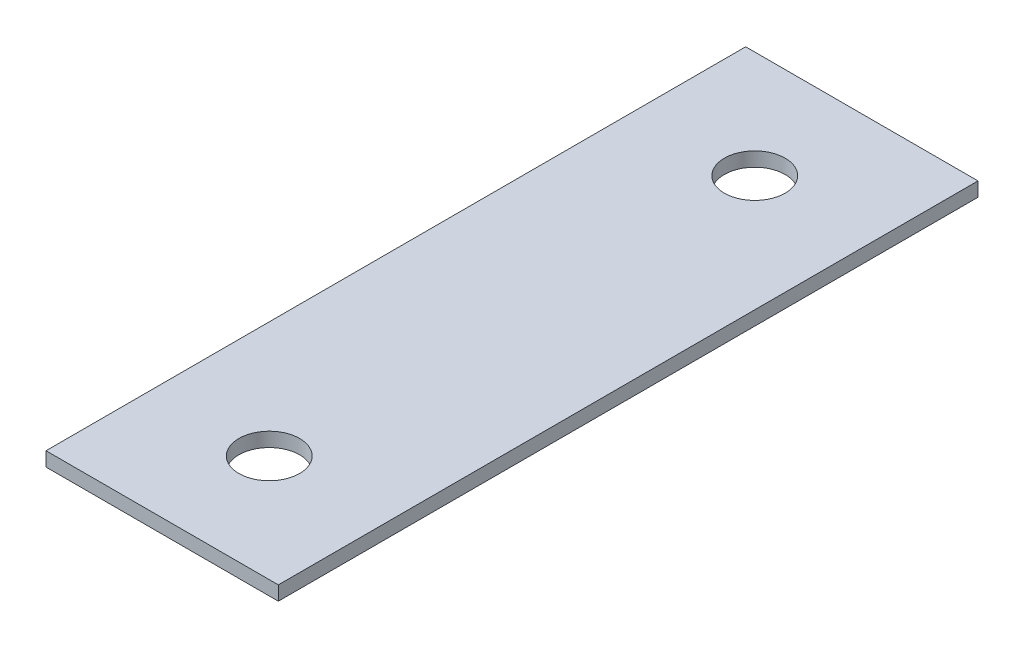
ISO-10303-21;
HEADER;
FILE_DESCRIPTION(('STEP AP214'),'2;1');
FILE_NAME('part.step','',(''),(''),'','','');
FILE_SCHEMA(('AUTOMOTIVE_DESIGN { 1 0 10303 214 1 1 1 1 }'));
ENDSEC;
DATA;
#1=APPLICATION_CONTEXT('core data for automotive mechanical design processes');
#2=APPLICATION_PROTOCOL_DEFINITION('international standard','automotive_design',2000,#1);
#3=PRODUCT_CONTEXT('',#1,'mechanical');
#4=PRODUCT('Part','Part','',(#3));
#5=PRODUCT_RELATED_PRODUCT_CATEGORY('part','',(#4));
#6=PRODUCT_DEFINITION_FORMATION('','',#4);
#7=PRODUCT_DEFINITION_CONTEXT('part definition',#1,'design');
#8=PRODUCT_DEFINITION('design','',#6,#7);
#9=PRODUCT_DEFINITION_SHAPE('','',#8);
#10=(LENGTH_UNIT() NAMED_UNIT(*) SI_UNIT(.MILLI.,.METRE.));
#11=(NAMED_UNIT(*) PLANE_ANGLE_UNIT() SI_UNIT($,.RADIAN.));
#12=(NAMED_UNIT(*) SI_UNIT($,.STERADIAN.) SOLID_ANGLE_UNIT());
#13=UNCERTAINTY_MEASURE_WITH_UNIT(LENGTH_MEASURE(1.E-05),#10,'distance_accuracy_value','');
#14=(GEOMETRIC_REPRESENTATION_CONTEXT(3) GLOBAL_UNCERTAINTY_ASSIGNED_CONTEXT((#13)) GLOBAL_UNIT_ASSIGNED_CONTEXT((#10,
#11,#12)) REPRESENTATION_CONTEXT('',''));
#15=CARTESIAN_POINT('',(0.,0.,0.));
#16=DIRECTION('',(0.,0.,1.));
#17=DIRECTION('',(1.,0.,0.));
#18=AXIS2_PLACEMENT_3D('',#15,#16,#17);
#19=CARTESIAN_POINT('',(0.,0.79375,0.));
#20=DIRECTION('',(1.,0.,0.));
#21=DIRECTION('',(0.,0.,-1.));
#22=AXIS2_PLACEMENT_3D('',#19,#20,#21);
#23=PLANE('',#22);
#24=DIRECTION('',(0.,0.,1.));
#25=VECTOR('',#24,1.);
#26=CARTESIAN_POINT('',(0.,0.,0.));
#27=LINE('',#26,#25);
#28=CARTESIAN_POINT('',(0.,0.,-39.1668));
#29=VERTEX_POINT('',#28);
#30=CARTESIAN_POINT('',(0.,0.,0.));
#31=VERTEX_POINT('',#30);
#32=EDGE_CURVE('E82',#29,#31,#27,.T.);
#33=ORIENTED_EDGE('',*,*,#32,.T.);
#34=DIRECTION('',(0.,-1.,0.));
#35=VECTOR('',#34,1.);
#36=CARTESIAN_POINT('',(0.,0.79375,0.));
#37=LINE('',#36,#35);
#38=CARTESIAN_POINT('',(0.,0.79375,0.));
#39=VERTEX_POINT('',#38);
#40=EDGE_CURVE('E11',#39,#31,#37,.T.);
#41=ORIENTED_EDGE('',*,*,#40,.F.);
#42=DIRECTION('',(0.,0.,1.));
#43=VECTOR('',#42,1.);
#44=CARTESIAN_POINT('',(0.,0.79375,0.));
#45=LINE('',#44,#43);
#46=CARTESIAN_POINT('',(0.,0.79375,-39.1668));
#47=VERTEX_POINT('',#46);
#48=EDGE_CURVE('E69',#47,#39,#45,.T.);
#49=ORIENTED_EDGE('',*,*,#48,.F.);
#50=DIRECTION('',(0.,-1.,0.));
#51=VECTOR('',#50,1.);
#52=CARTESIAN_POINT('',(0.,0.79375,-39.1668));
#53=LINE('',#52,#51);
#54=EDGE_CURVE('E78',#47,#29,#53,.T.);
#55=ORIENTED_EDGE('',*,*,#54,.T.);
#56=EDGE_LOOP('',(#33,#41,#49,#55));
#57=FACE_BOUND('',#56,.T.);
#58=ADVANCED_FACE('F17',(#57),#23,.F.);
#59=CARTESIAN_POINT('',(0.,0.79375,0.));
#60=DIRECTION('',(0.,0.,-1.));
#61=DIRECTION('',(-1.,0.,0.));
#62=AXIS2_PLACEMENT_3D('',#59,#60,#61);
#63=PLANE('',#62);
#64=DIRECTION('',(1.,0.,0.));
#65=VECTOR('',#64,1.);
#66=CARTESIAN_POINT('',(0.,0.,0.));
#67=LINE('',#66,#65);
#68=CARTESIAN_POINT('',(13.0048,0.,0.));
#69=VERTEX_POINT('',#68);
#70=EDGE_CURVE('E73',#31,#69,#67,.T.);
#71=ORIENTED_EDGE('',*,*,#70,.T.);
#72=DIRECTION('',(0.,-1.,0.));
#73=VECTOR('',#72,1.);
#74=CARTESIAN_POINT('',(13.0048,0.79375,0.));
#75=LINE('',#74,#73);
#76=CARTESIAN_POINT('',(13.0048,0.79375,0.));
#77=VERTEX_POINT('',#76);
#78=EDGE_CURVE('E26',#77,#69,#75,.T.);
#79=ORIENTED_EDGE('',*,*,#78,.F.);
#80=DIRECTION('',(1.,0.,0.));
#81=VECTOR('',#80,1.);
#82=CARTESIAN_POINT('',(0.,0.79375,0.));
#83=LINE('',#82,#81);
#84=EDGE_CURVE('E64',#39,#77,#83,.T.);
#85=ORIENTED_EDGE('',*,*,#84,.F.);
#86=ORIENTED_EDGE('',*,*,#40,.T.);
#87=EDGE_LOOP('',(#71,#79,#85,#86));
#88=FACE_BOUND('',#87,.T.);
#89=ADVANCED_FACE('F72',(#88),#63,.F.);
#90=CARTESIAN_POINT('',(13.0048,0.79375,0.));
#91=DIRECTION('',(-1.,0.,0.));
#92=DIRECTION('',(0.,0.,1.));
#93=AXIS2_PLACEMENT_3D('',#90,#91,#92);
#94=PLANE('',#93);
#95=DIRECTION('',(0.,0.,-1.));
#96=VECTOR('',#95,1.);
#97=CARTESIAN_POINT('',(13.0048,0.,0.));
#98=LINE('',#97,#96);
#99=CARTESIAN_POINT('',(13.0048,0.,-39.1668));
#100=VERTEX_POINT('',#99);
#101=EDGE_CURVE('E51',#69,#100,#98,.T.);
#102=ORIENTED_EDGE('',*,*,#101,.T.);
#103=DIRECTION('',(0.,-1.,0.));
#104=VECTOR('',#103,1.);
#105=CARTESIAN_POINT('',(13.0048,0.79375,-39.1668));
#106=LINE('',#105,#104);
#107=CARTESIAN_POINT('',(13.0048,0.79375,-39.1668));
#108=VERTEX_POINT('',#107);
#109=EDGE_CURVE('E74',#108,#100,#106,.T.);
#110=ORIENTED_EDGE('',*,*,#109,.F.);
#111=DIRECTION('',(0.,0.,-1.));
#112=VECTOR('',#111,1.);
#113=CARTESIAN_POINT('',(13.0048,0.79375,0.));
#114=LINE('',#113,#112);
#115=EDGE_CURVE('E67',#77,#108,#114,.T.);
#116=ORIENTED_EDGE('',*,*,#115,.F.);
#117=ORIENTED_EDGE('',*,*,#78,.T.);
#118=EDGE_LOOP('',(#102,#110,#116,#117));
#119=FACE_BOUND('',#118,.T.);
#120=ADVANCED_FACE('F76',(#119),#94,.F.);
#121=CARTESIAN_POINT('',(0.,0.79375,-39.1668));
#122=DIRECTION('',(0.,0.,1.));
#123=DIRECTION('',(1.,0.,0.));
#124=AXIS2_PLACEMENT_3D('',#121,#122,#123);
#125=PLANE('',#124);
#126=DIRECTION('',(-1.,0.,0.));
#127=VECTOR('',#126,1.);
#128=CARTESIAN_POINT('',(0.,0.,-39.1668));
#129=LINE('',#128,#127);
#130=EDGE_CURVE('E57',#100,#29,#129,.T.);
#131=ORIENTED_EDGE('',*,*,#130,.T.);
#132=ORIENTED_EDGE('',*,*,#54,.F.);
#133=DIRECTION('',(-1.,0.,0.));
#134=VECTOR('',#133,1.);
#135=CARTESIAN_POINT('',(0.,0.79375,-39.1668));
#136=LINE('',#135,#134);
#137=EDGE_CURVE('E34',#108,#47,#136,.T.);
#138=ORIENTED_EDGE('',*,*,#137,.F.);
#139=ORIENTED_EDGE('',*,*,#109,.T.);
#140=EDGE_LOOP('',(#131,#132,#138,#139));
#141=FACE_BOUND('',#140,.T.);
#142=ADVANCED_FACE('F90',(#141),#125,.F.);
#143=CARTESIAN_POINT('',(0.,0.79375,0.));
#144=DIRECTION('',(0.,-1.,0.));
#145=DIRECTION('',(0.,0.,-1.));
#146=AXIS2_PLACEMENT_3D('',#143,#144,#145);
#147=PLANE('',#146);
#148=CARTESIAN_POINT('',(6.5024,0.79375,-5.9944));
#149=DIRECTION('',(0.,1.,0.));
#150=DIRECTION('',(0.,0.,1.));
#151=AXIS2_PLACEMENT_3D('',#148,#149,#150);
#152=CIRCLE('',#151,1.7);
#153=CARTESIAN_POINT('',(6.5024,0.79375,-4.2944));
#154=VERTEX_POINT('',#153);
#155=EDGE_CURVE('E101',#154,#154,#152,.T.);
#156=ORIENTED_EDGE('',*,*,#155,.F.);
#157=EDGE_LOOP('',(#156));
#158=FACE_BOUND('',#157,.T.);
#159=CARTESIAN_POINT('',(6.5024,0.79375,-33.1724));
#160=DIRECTION('',(0.,1.,0.));
#161=DIRECTION('',(0.,0.,1.));
#162=AXIS2_PLACEMENT_3D('',#159,#160,#161);
#163=CIRCLE('',#162,1.7);
#164=CARTESIAN_POINT('',(6.5024,0.79375,-31.4724));
#165=VERTEX_POINT('',#164);
#166=EDGE_CURVE('E98',#165,#165,#163,.T.);
#167=ORIENTED_EDGE('',*,*,#166,.F.);
#168=EDGE_LOOP('',(#167));
#169=FACE_BOUND('',#168,.T.);
#170=ORIENTED_EDGE('',*,*,#48,.T.);
#171=ORIENTED_EDGE('',*,*,#84,.T.);
#172=ORIENTED_EDGE('',*,*,#115,.T.);
#173=ORIENTED_EDGE('',*,*,#137,.T.);
#174=EDGE_LOOP('',(#170,#171,#172,#173));
#175=FACE_BOUND('',#174,.T.);
#176=ADVANCED_FACE('F65',(#158,#169,#175),#147,.F.);
#177=CARTESIAN_POINT('',(0.,0.,0.));
#178=DIRECTION('',(0.,-1.,0.));
#179=DIRECTION('',(0.,0.,-1.));
#180=AXIS2_PLACEMENT_3D('',#177,#178,#179);
#181=PLANE('',#180);
#182=CARTESIAN_POINT('',(6.5024,0.,-5.9944));
#183=DIRECTION('',(0.,-1.,0.));
#184=DIRECTION('',(0.,0.,-1.));
#185=AXIS2_PLACEMENT_3D('',#182,#183,#184);
#186=CIRCLE('',#185,1.7);
#187=CARTESIAN_POINT('',(6.5024,0.,-7.6944));
#188=VERTEX_POINT('',#187);
#189=EDGE_CURVE('E20',#188,#188,#186,.T.);
#190=ORIENTED_EDGE('',*,*,#189,.F.);
#191=EDGE_LOOP('',(#190));
#192=FACE_BOUND('',#191,.T.);
#193=CARTESIAN_POINT('',(6.5024,0.,-33.1724));
#194=DIRECTION('',(0.,-1.,0.));
#195=DIRECTION('',(0.,0.,-1.));
#196=AXIS2_PLACEMENT_3D('',#193,#194,#195);
#197=CIRCLE('',#196,1.7);
#198=CARTESIAN_POINT('',(6.5024,0.,-34.8724));
#199=VERTEX_POINT('',#198);
#200=EDGE_CURVE('E85',#199,#199,#197,.T.);
#201=ORIENTED_EDGE('',*,*,#200,.F.);
#202=EDGE_LOOP('',(#201));
#203=FACE_BOUND('',#202,.T.);
#204=ORIENTED_EDGE('',*,*,#32,.F.);
#205=ORIENTED_EDGE('',*,*,#130,.F.);
#206=ORIENTED_EDGE('',*,*,#101,.F.);
#207=ORIENTED_EDGE('',*,*,#70,.F.);
#208=EDGE_LOOP('',(#204,#205,#206,#207));
#209=FACE_BOUND('',#208,.T.);
#210=ADVANCED_FACE('F93',(#192,#203,#209),#181,.T.);
#211=CARTESIAN_POINT('',(6.5024,0.79375,-33.1724));
#212=DIRECTION('',(0.,1.,0.));
#213=DIRECTION('',(0.,0.,1.));
#214=AXIS2_PLACEMENT_3D('',#211,#212,#213);
#215=CYLINDRICAL_SURFACE('',#214,1.7);
#216=ORIENTED_EDGE('',*,*,#200,.T.);
#217=EDGE_LOOP('',(#216));
#218=FACE_BOUND('',#217,.T.);
#219=ORIENTED_EDGE('',*,*,#166,.T.);
#220=EDGE_LOOP('',(#219));
#221=FACE_BOUND('',#220,.T.);
#222=ADVANCED_FACE('F112',(#218,#221),#215,.F.);
#223=CARTESIAN_POINT('',(6.5024,0.79375,-5.9944));
#224=DIRECTION('',(0.,1.,0.));
#225=DIRECTION('',(0.,0.,1.));
#226=AXIS2_PLACEMENT_3D('',#223,#224,#225);
#227=CYLINDRICAL_SURFACE('',#226,1.7);
#228=ORIENTED_EDGE('',*,*,#189,.T.);
#229=EDGE_LOOP('',(#228));
#230=FACE_BOUND('',#229,.T.);
#231=ORIENTED_EDGE('',*,*,#155,.T.);
#232=EDGE_LOOP('',(#231));
#233=FACE_BOUND('',#232,.T.);
#234=ADVANCED_FACE('F108',(#230,#233),#227,.F.);
#235=CLOSED_SHELL('',(#58,#89,#120,#142,#176,#210,#222,#234));
#236=MANIFOLD_SOLID_BREP('B1',#235);
#237=ADVANCED_BREP_SHAPE_REPRESENTATION('',(#18,#236),#14);
#238=SHAPE_DEFINITION_REPRESENTATION(#9,#237);
ENDSEC;
END-ISO-10303-21;
